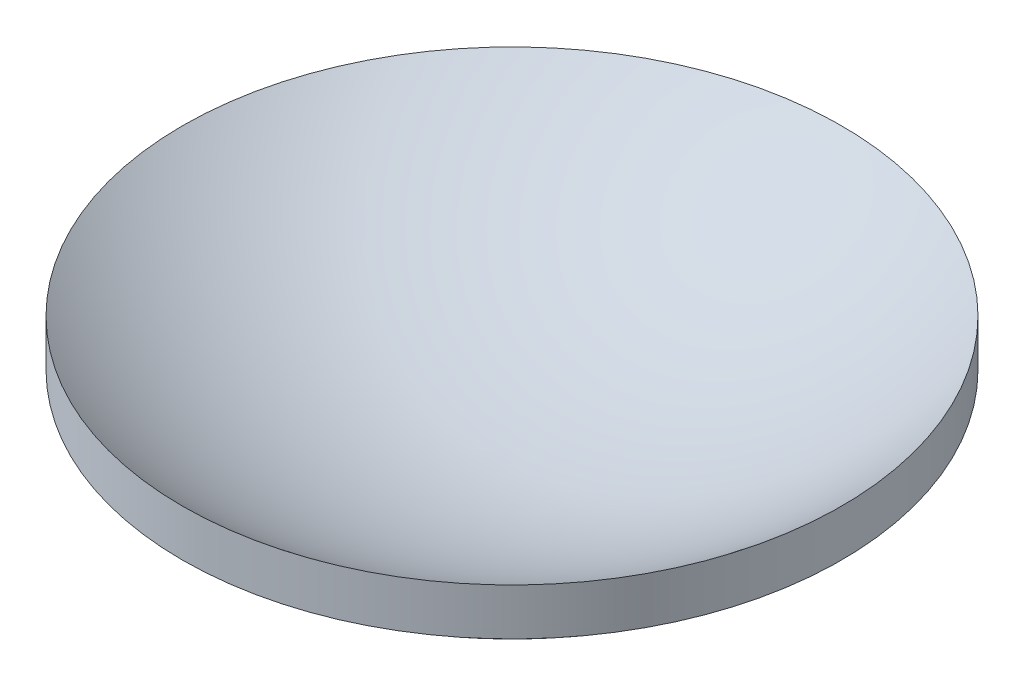
ISO-10303-21;
HEADER;
FILE_DESCRIPTION(('STEP AP214'),'2;1');
FILE_NAME('part.step','',(''),(''),'','','');
FILE_SCHEMA(('AUTOMOTIVE_DESIGN { 1 0 10303 214 1 1 1 1 }'));
ENDSEC;
DATA;
#1=APPLICATION_CONTEXT('core data for automotive mechanical design processes');
#2=APPLICATION_PROTOCOL_DEFINITION('international standard','automotive_design',2000,#1);
#3=PRODUCT_CONTEXT('',#1,'mechanical');
#4=PRODUCT('Part','Part','',(#3));
#5=PRODUCT_RELATED_PRODUCT_CATEGORY('part','',(#4));
#6=PRODUCT_DEFINITION_FORMATION('','',#4);
#7=PRODUCT_DEFINITION_CONTEXT('part definition',#1,'design');
#8=PRODUCT_DEFINITION('design','',#6,#7);
#9=PRODUCT_DEFINITION_SHAPE('','',#8);
#10=(LENGTH_UNIT() NAMED_UNIT(*) SI_UNIT(.MILLI.,.METRE.));
#11=(NAMED_UNIT(*) PLANE_ANGLE_UNIT() SI_UNIT($,.RADIAN.));
#12=(NAMED_UNIT(*) SI_UNIT($,.STERADIAN.) SOLID_ANGLE_UNIT());
#13=UNCERTAINTY_MEASURE_WITH_UNIT(LENGTH_MEASURE(1.E-05),#10,'distance_accuracy_value','');
#14=(GEOMETRIC_REPRESENTATION_CONTEXT(3) GLOBAL_UNCERTAINTY_ASSIGNED_CONTEXT((#13)) GLOBAL_UNIT_ASSIGNED_CONTEXT((#10,
#11,#12)) REPRESENTATION_CONTEXT('',''));
#15=CARTESIAN_POINT('',(0.,0.,0.));
#16=DIRECTION('',(0.,0.,1.));
#17=DIRECTION('',(1.,0.,0.));
#18=AXIS2_PLACEMENT_3D('',#15,#16,#17);
#19=CARTESIAN_POINT('',(0.,0.,0.));
#20=DIRECTION('',(0.,1.,0.));
#21=DIRECTION('',(-1.,0.,0.));
#22=AXIS2_PLACEMENT_3D('',#19,#20,#21);
#23=SPHERICAL_SURFACE('',#22,7500.);
#24=CARTESIAN_POINT('',(0.,-6000.,0.));
#25=DIRECTION('',(0.,1.,0.));
#26=DIRECTION('',(0.,0.,1.));
#27=AXIS2_PLACEMENT_3D('',#24,#25,#26);
#28=CIRCLE('',#27,4500.);
#29=CARTESIAN_POINT('',(0.,-6000.,4500.));
#30=VERTEX_POINT('',#29);
#31=EDGE_CURVE('E10',#30,#30,#28,.T.);
#32=ORIENTED_EDGE('',*,*,#31,.F.);
#33=EDGE_LOOP('',(#32));
#34=FACE_BOUND('',#33,.T.);
#35=ADVANCED_FACE('F37',(#34),#23,.T.);
#36=CARTESIAN_POINT('',(0.,0.,0.));
#37=DIRECTION('',(0.,1.,0.));
#38=DIRECTION('',(0.,0.,1.));
#39=AXIS2_PLACEMENT_3D('',#36,#37,#38);
#40=CYLINDRICAL_SURFACE('',#39,4500.);
#41=ORIENTED_EDGE('',*,*,#31,.T.);
#42=EDGE_LOOP('',(#41));
#43=FACE_BOUND('',#42,.T.);
#44=CARTESIAN_POINT('',(0.,-5361.9026473818,0.));
#45=DIRECTION('',(0.,1.,0.));
#46=DIRECTION('',(0.,0.,1.));
#47=AXIS2_PLACEMENT_3D('',#44,#45,#46);
#48=CIRCLE('',#47,4500.);
#49=CARTESIAN_POINT('',(0.,-5361.9026473818,4500.));
#50=VERTEX_POINT('',#49);
#51=EDGE_CURVE('E44',#50,#50,#48,.T.);
#52=ORIENTED_EDGE('',*,*,#51,.F.);
#53=EDGE_LOOP('',(#52));
#54=FACE_BOUND('',#53,.T.);
#55=ADVANCED_FACE('F53',(#43,#54),#40,.T.);
#56=CARTESIAN_POINT('',(0.,0.,0.));
#57=DIRECTION('',(0.,1.,0.));
#58=DIRECTION('',(-1.,0.,0.));
#59=AXIS2_PLACEMENT_3D('',#56,#57,#58);
#60=SPHERICAL_SURFACE('',#59,7000.);
#61=ORIENTED_EDGE('',*,*,#51,.T.);
#62=EDGE_LOOP('',(#61));
#63=FACE_BOUND('',#62,.T.);
#64=ADVANCED_FACE('F51',(#63),#60,.F.);
#65=CLOSED_SHELL('',(#35,#55,#64));
#66=MANIFOLD_SOLID_BREP('B2',#65);
#67=ADVANCED_BREP_SHAPE_REPRESENTATION('',(#18,#66),#14);
#68=SHAPE_DEFINITION_REPRESENTATION(#9,#67);
ENDSEC;
END-ISO-10303-21;
